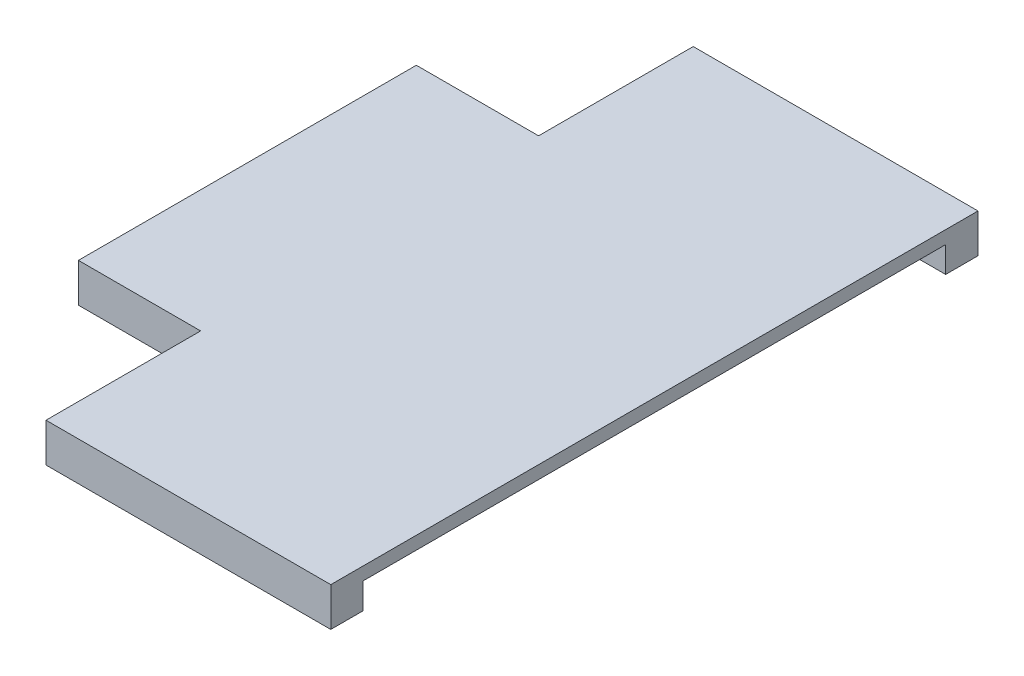
ISO-10303-21;
HEADER;
FILE_DESCRIPTION(('STEP AP214'),'2;1');
FILE_NAME('part.step','',(''),(''),'','','');
FILE_SCHEMA(('AUTOMOTIVE_DESIGN { 1 0 10303 214 1 1 1 1 }'));
ENDSEC;
DATA;
#1=APPLICATION_CONTEXT('core data for automotive mechanical design processes');
#2=APPLICATION_PROTOCOL_DEFINITION('international standard','automotive_design',2000,#1);
#3=PRODUCT_CONTEXT('',#1,'mechanical');
#4=PRODUCT('Part','Part','',(#3));
#5=PRODUCT_RELATED_PRODUCT_CATEGORY('part','',(#4));
#6=PRODUCT_DEFINITION_FORMATION('','',#4);
#7=PRODUCT_DEFINITION_CONTEXT('part definition',#1,'design');
#8=PRODUCT_DEFINITION('design','',#6,#7);
#9=PRODUCT_DEFINITION_SHAPE('','',#8);
#10=(LENGTH_UNIT() NAMED_UNIT(*) SI_UNIT(.MILLI.,.METRE.));
#11=(NAMED_UNIT(*) PLANE_ANGLE_UNIT() SI_UNIT($,.RADIAN.));
#12=(NAMED_UNIT(*) SI_UNIT($,.STERADIAN.) SOLID_ANGLE_UNIT());
#13=UNCERTAINTY_MEASURE_WITH_UNIT(LENGTH_MEASURE(1.E-05),#10,'distance_accuracy_value','');
#14=(GEOMETRIC_REPRESENTATION_CONTEXT(3) GLOBAL_UNCERTAINTY_ASSIGNED_CONTEXT((#13)) GLOBAL_UNIT_ASSIGNED_CONTEXT((#10,
#11,#12)) REPRESENTATION_CONTEXT('',''));
#15=CARTESIAN_POINT('',(0.,0.,0.));
#16=DIRECTION('',(0.,0.,1.));
#17=DIRECTION('',(1.,0.,0.));
#18=AXIS2_PLACEMENT_3D('',#15,#16,#17);
#19=CARTESIAN_POINT('',(-56.,0.,-76.1063147334456));
#20=DIRECTION('',(0.,1.,0.));
#21=DIRECTION('',(0.,0.,1.));
#22=AXIS2_PLACEMENT_3D('',#19,#20,#21);
#23=PLANE('',#22);
#24=DIRECTION('',(0.,0.,1.));
#25=VECTOR('',#24,1.);
#26=CARTESIAN_POINT('',(-56.,0.,0.));
#27=LINE('',#26,#25);
#28=CARTESIAN_POINT('',(-56.,0.,-4.99999999999997));
#29=VERTEX_POINT('',#28);
#30=CARTESIAN_POINT('',(-56.,0.,0.));
#31=VERTEX_POINT('',#30);
#32=EDGE_CURVE('E148',#29,#31,#27,.T.);
#33=ORIENTED_EDGE('',*,*,#32,.F.);
#34=DIRECTION('',(-1.,0.,0.));
#35=VECTOR('',#34,1.);
#36=CARTESIAN_POINT('',(-56.,0.,-4.99999999999997));
#37=LINE('',#36,#35);
#38=CARTESIAN_POINT('',(-12.,0.,-4.99999999999997));
#39=VERTEX_POINT('',#38);
#40=EDGE_CURVE('E217',#39,#29,#37,.T.);
#41=ORIENTED_EDGE('',*,*,#40,.F.);
#42=DIRECTION('',(0.,0.,-1.));
#43=VECTOR('',#42,1.);
#44=CARTESIAN_POINT('',(-12.,0.,-100.));
#45=LINE('',#44,#43);
#46=CARTESIAN_POINT('',(-12.,0.,0.));
#47=VERTEX_POINT('',#46);
#48=EDGE_CURVE('E152',#47,#39,#45,.T.);
#49=ORIENTED_EDGE('',*,*,#48,.F.);
#50=DIRECTION('',(1.,0.,0.));
#51=VECTOR('',#50,1.);
#52=CARTESIAN_POINT('',(-12.,0.,0.));
#53=LINE('',#52,#51);
#54=EDGE_CURVE('E122',#31,#47,#53,.T.);
#55=ORIENTED_EDGE('',*,*,#54,.F.);
#56=EDGE_LOOP('',(#33,#41,#49,#55));
#57=FACE_BOUND('',#56,.T.);
#58=ADVANCED_FACE('F31',(#57),#23,.F.);
#59=CARTESIAN_POINT('',(-12.,0.,-95.));
#60=VERTEX_POINT('',#59);
#61=CARTESIAN_POINT('',(-12.,0.,-100.));
#62=VERTEX_POINT('',#61);
#63=EDGE_CURVE('E151',#60,#62,#45,.T.);
#64=ORIENTED_EDGE('',*,*,#63,.F.);
#65=DIRECTION('',(1.,0.,0.));
#66=VECTOR('',#65,1.);
#67=CARTESIAN_POINT('',(-56.,0.,-95.));
#68=LINE('',#67,#66);
#69=CARTESIAN_POINT('',(-56.,0.,-95.));
#70=VERTEX_POINT('',#69);
#71=EDGE_CURVE('E214',#70,#60,#68,.T.);
#72=ORIENTED_EDGE('',*,*,#71,.F.);
#73=DIRECTION('',(0.,0.,1.));
#74=VECTOR('',#73,1.);
#75=CARTESIAN_POINT('',(-56.,0.,-100.));
#76=LINE('',#75,#74);
#77=CARTESIAN_POINT('',(-56.,0.,-100.));
#78=VERTEX_POINT('',#77);
#79=EDGE_CURVE('E135',#78,#70,#76,.T.);
#80=ORIENTED_EDGE('',*,*,#79,.F.);
#81=DIRECTION('',(-1.,0.,0.));
#82=VECTOR('',#81,1.);
#83=CARTESIAN_POINT('',(-12.,0.,-100.));
#84=LINE('',#83,#82);
#85=EDGE_CURVE('E82',#62,#78,#84,.T.);
#86=ORIENTED_EDGE('',*,*,#85,.F.);
#87=EDGE_LOOP('',(#64,#72,#80,#86));
#88=FACE_BOUND('',#87,.T.);
#89=ADVANCED_FACE('F331',(#88),#23,.F.);
#90=DIRECTION('',(-1.,0.,0.));
#91=VECTOR('',#90,1.);
#92=CARTESIAN_POINT('',(-74.8864883295229,0.,-76.1063147334456));
#93=LINE('',#92,#91);
#94=CARTESIAN_POINT('',(-56.,0.,-76.1063147334456));
#95=VERTEX_POINT('',#94);
#96=CARTESIAN_POINT('',(-74.8864883295229,0.,-76.1063147334456));
#97=VERTEX_POINT('',#96);
#98=EDGE_CURVE('E138',#95,#97,#93,.T.);
#99=ORIENTED_EDGE('',*,*,#98,.F.);
#100=DIRECTION('',(0.,0.,-1.));
#101=VECTOR('',#100,1.);
#102=CARTESIAN_POINT('',(-56.,0.,-95.));
#103=LINE('',#102,#101);
#104=CARTESIAN_POINT('',(-56.,0.,-73.2832579399384));
#105=VERTEX_POINT('',#104);
#106=EDGE_CURVE('E211',#105,#95,#103,.T.);
#107=ORIENTED_EDGE('',*,*,#106,.F.);
#108=DIRECTION('',(1.,0.,0.));
#109=VECTOR('',#108,1.);
#110=CARTESIAN_POINT('',(-74.8864883295229,0.,-73.2832579399384));
#111=LINE('',#110,#109);
#112=CARTESIAN_POINT('',(-74.8864883295229,0.,-73.2832579399384));
#113=VERTEX_POINT('',#112);
#114=EDGE_CURVE('E208',#113,#105,#111,.T.);
#115=ORIENTED_EDGE('',*,*,#114,.F.);
#116=DIRECTION('',(0.,0.,1.));
#117=VECTOR('',#116,1.);
#118=CARTESIAN_POINT('',(-74.8864883295229,0.,-23.8936852665544));
#119=LINE('',#118,#117);
#120=EDGE_CURVE('E142',#97,#113,#119,.T.);
#121=ORIENTED_EDGE('',*,*,#120,.F.);
#122=EDGE_LOOP('',(#99,#107,#115,#121));
#123=FACE_BOUND('',#122,.T.);
#124=ADVANCED_FACE('F310',(#123),#23,.F.);
#125=CARTESIAN_POINT('',(-56.,6.,-100.));
#126=DIRECTION('',(1.,0.,0.));
#127=DIRECTION('',(0.,0.,-1.));
#128=AXIS2_PLACEMENT_3D('',#125,#126,#127);
#129=PLANE('',#128);
#130=ORIENTED_EDGE('',*,*,#79,.T.);
#131=DIRECTION('',(0.,-1.,0.));
#132=VECTOR('',#131,1.);
#133=CARTESIAN_POINT('',(-56.,4.,-95.));
#134=LINE('',#133,#132);
#135=CARTESIAN_POINT('',(-56.,4.,-95.));
#136=VERTEX_POINT('',#135);
#137=EDGE_CURVE('E185',#136,#70,#134,.T.);
#138=ORIENTED_EDGE('',*,*,#137,.F.);
#139=DIRECTION('',(0.,0.,-1.));
#140=VECTOR('',#139,1.);
#141=CARTESIAN_POINT('',(-56.,4.,-95.));
#142=LINE('',#141,#140);
#143=CARTESIAN_POINT('',(-56.,4.,-76.1063147334456));
#144=VERTEX_POINT('',#143);
#145=EDGE_CURVE('E182',#144,#136,#142,.T.);
#146=ORIENTED_EDGE('',*,*,#145,.F.);
#147=DIRECTION('',(0.,-1.,0.));
#148=VECTOR('',#147,1.);
#149=CARTESIAN_POINT('',(-56.,6.,-76.1063147334456));
#150=LINE('',#149,#148);
#151=CARTESIAN_POINT('',(-56.,6.,-76.1063147334456));
#152=VERTEX_POINT('',#151);
#153=EDGE_CURVE('E39',#152,#144,#150,.T.);
#154=ORIENTED_EDGE('',*,*,#153,.F.);
#155=DIRECTION('',(0.,0.,1.));
#156=VECTOR('',#155,1.);
#157=CARTESIAN_POINT('',(-56.,6.,-100.));
#158=LINE('',#157,#156);
#159=CARTESIAN_POINT('',(-56.,6.,-100.));
#160=VERTEX_POINT('',#159);
#161=EDGE_CURVE('E155',#160,#152,#158,.T.);
#162=ORIENTED_EDGE('',*,*,#161,.F.);
#163=DIRECTION('',(0.,-1.,0.));
#164=VECTOR('',#163,1.);
#165=CARTESIAN_POINT('',(-56.,6.,-100.));
#166=LINE('',#165,#164);
#167=EDGE_CURVE('E131',#160,#78,#166,.T.);
#168=ORIENTED_EDGE('',*,*,#167,.T.);
#169=EDGE_LOOP('',(#130,#138,#146,#154,#162,#168));
#170=FACE_BOUND('',#169,.T.);
#171=ADVANCED_FACE('F33',(#170),#129,.F.);
#172=CARTESIAN_POINT('',(-74.8864883295229,6.,-76.1063147334456));
#173=DIRECTION('',(0.,0.,1.));
#174=DIRECTION('',(1.,0.,0.));
#175=AXIS2_PLACEMENT_3D('',#172,#173,#174);
#176=PLANE('',#175);
#177=ORIENTED_EDGE('',*,*,#98,.T.);
#178=DIRECTION('',(0.,-1.,0.));
#179=VECTOR('',#178,1.);
#180=CARTESIAN_POINT('',(-74.8864883295229,6.,-76.1063147334456));
#181=LINE('',#180,#179);
#182=CARTESIAN_POINT('',(-74.8864883295229,6.,-76.1063147334456));
#183=VERTEX_POINT('',#182);
#184=EDGE_CURVE('E165',#183,#97,#181,.T.);
#185=ORIENTED_EDGE('',*,*,#184,.F.);
#186=DIRECTION('',(-1.,0.,0.));
#187=VECTOR('',#186,1.);
#188=CARTESIAN_POINT('',(-74.8864883295229,6.,-76.1063147334456));
#189=LINE('',#188,#187);
#190=EDGE_CURVE('E91',#152,#183,#189,.T.);
#191=ORIENTED_EDGE('',*,*,#190,.F.);
#192=ORIENTED_EDGE('',*,*,#153,.T.);
#193=DIRECTION('',(0.,-1.,0.));
#194=VECTOR('',#193,1.);
#195=CARTESIAN_POINT('',(-56.,6.,-76.1063147334456));
#196=LINE('',#195,#194);
#197=EDGE_CURVE('E173',#144,#95,#196,.T.);
#198=ORIENTED_EDGE('',*,*,#197,.T.);
#199=EDGE_LOOP('',(#177,#185,#191,#192,#198));
#200=FACE_BOUND('',#199,.T.);
#201=ADVANCED_FACE('F170',(#200),#176,.F.);
#202=CARTESIAN_POINT('',(-74.8864883295229,6.,-23.8936852665544));
#203=DIRECTION('',(1.,0.,0.));
#204=DIRECTION('',(0.,0.,-1.));
#205=AXIS2_PLACEMENT_3D('',#202,#203,#204);
#206=PLANE('',#205);
#207=ORIENTED_EDGE('',*,*,#120,.T.);
#208=DIRECTION('',(0.,-1.,0.));
#209=VECTOR('',#208,1.);
#210=CARTESIAN_POINT('',(-74.8864883295229,4.,-73.2832579399384));
#211=LINE('',#210,#209);
#212=CARTESIAN_POINT('',(-74.8864883295229,4.,-73.2832579399384));
#213=VERTEX_POINT('',#212);
#214=EDGE_CURVE('E234',#213,#113,#211,.T.);
#215=ORIENTED_EDGE('',*,*,#214,.F.);
#216=DIRECTION('',(0.,0.,-1.));
#217=VECTOR('',#216,1.);
#218=CARTESIAN_POINT('',(-74.8864883295229,4.,-73.2832579399384));
#219=LINE('',#218,#217);
#220=CARTESIAN_POINT('',(-74.8864883295229,4.,-26.7167420600616));
#221=VERTEX_POINT('',#220);
#222=EDGE_CURVE('E195',#221,#213,#219,.T.);
#223=ORIENTED_EDGE('',*,*,#222,.F.);
#224=DIRECTION('',(0.,-1.,0.));
#225=VECTOR('',#224,1.);
#226=CARTESIAN_POINT('',(-74.8864883295229,4.,-26.7167420600616));
#227=LINE('',#226,#225);
#228=CARTESIAN_POINT('',(-74.8864883295229,0.,-26.7167420600616));
#229=VERTEX_POINT('',#228);
#230=EDGE_CURVE('E237',#221,#229,#227,.T.);
#231=ORIENTED_EDGE('',*,*,#230,.T.);
#232=CARTESIAN_POINT('',(-74.8864883295229,0.,-23.8936852665544));
#233=VERTEX_POINT('',#232);
#234=EDGE_CURVE('E141',#229,#233,#119,.T.);
#235=ORIENTED_EDGE('',*,*,#234,.T.);
#236=DIRECTION('',(0.,-1.,0.));
#237=VECTOR('',#236,1.);
#238=CARTESIAN_POINT('',(-74.8864883295229,6.,-23.8936852665544));
#239=LINE('',#238,#237);
#240=CARTESIAN_POINT('',(-74.8864883295229,6.,-23.8936852665544));
#241=VERTEX_POINT('',#240);
#242=EDGE_CURVE('E162',#241,#233,#239,.T.);
#243=ORIENTED_EDGE('',*,*,#242,.F.);
#244=DIRECTION('',(0.,0.,1.));
#245=VECTOR('',#244,1.);
#246=CARTESIAN_POINT('',(-74.8864883295229,6.,-23.8936852665544));
#247=LINE('',#246,#245);
#248=EDGE_CURVE('E246',#183,#241,#247,.T.);
#249=ORIENTED_EDGE('',*,*,#248,.F.);
#250=ORIENTED_EDGE('',*,*,#184,.T.);
#251=EDGE_LOOP('',(#207,#215,#223,#231,#235,#243,#249,#250));
#252=FACE_BOUND('',#251,.T.);
#253=ADVANCED_FACE('F298',(#252),#206,.F.);
#254=CARTESIAN_POINT('',(-74.8864883295229,6.,-23.8936852665544));
#255=DIRECTION('',(0.,0.,-1.));
#256=DIRECTION('',(-1.,0.,0.));
#257=AXIS2_PLACEMENT_3D('',#254,#255,#256);
#258=PLANE('',#257);
#259=DIRECTION('',(1.,0.,0.));
#260=VECTOR('',#259,1.);
#261=CARTESIAN_POINT('',(-74.8864883295229,0.,-23.8936852665544));
#262=LINE('',#261,#260);
#263=CARTESIAN_POINT('',(-56.,0.,-23.8936852665544));
#264=VERTEX_POINT('',#263);
#265=EDGE_CURVE('E145',#233,#264,#262,.T.);
#266=ORIENTED_EDGE('',*,*,#265,.T.);
#267=DIRECTION('',(0.,1.,0.));
#268=VECTOR('',#267,1.);
#269=CARTESIAN_POINT('',(-56.,6.,-23.8936852665544));
#270=LINE('',#269,#268);
#271=CARTESIAN_POINT('',(-56.,4.,-23.8936852665544));
#272=VERTEX_POINT('',#271);
#273=EDGE_CURVE('E139',#264,#272,#270,.T.);
#274=ORIENTED_EDGE('',*,*,#273,.T.);
#275=DIRECTION('',(0.,-1.,0.));
#276=VECTOR('',#275,1.);
#277=CARTESIAN_POINT('',(-56.,6.,-23.8936852665544));
#278=LINE('',#277,#276);
#279=CARTESIAN_POINT('',(-56.,6.,-23.8936852665544));
#280=VERTEX_POINT('',#279);
#281=EDGE_CURVE('E159',#280,#272,#278,.T.);
#282=ORIENTED_EDGE('',*,*,#281,.F.);
#283=DIRECTION('',(1.,0.,0.));
#284=VECTOR('',#283,1.);
#285=CARTESIAN_POINT('',(-74.8864883295229,6.,-23.8936852665544));
#286=LINE('',#285,#284);
#287=EDGE_CURVE('E248',#241,#280,#286,.T.);
#288=ORIENTED_EDGE('',*,*,#287,.F.);
#289=ORIENTED_EDGE('',*,*,#242,.T.);
#290=EDGE_LOOP('',(#266,#274,#282,#288,#289));
#291=FACE_BOUND('',#290,.T.);
#292=ADVANCED_FACE('F254',(#291),#258,.F.);
#293=CARTESIAN_POINT('',(-56.,6.,0.));
#294=DIRECTION('',(1.,0.,0.));
#295=DIRECTION('',(0.,0.,-1.));
#296=AXIS2_PLACEMENT_3D('',#293,#294,#295);
#297=PLANE('',#296);
#298=DIRECTION('',(0.,0.,-1.));
#299=VECTOR('',#298,1.);
#300=CARTESIAN_POINT('',(-56.,4.,-4.99999999999997));
#301=LINE('',#300,#299);
#302=CARTESIAN_POINT('',(-56.,4.,-4.99999999999997));
#303=VERTEX_POINT('',#302);
#304=EDGE_CURVE('E284',#303,#272,#301,.T.);
#305=ORIENTED_EDGE('',*,*,#304,.F.);
#306=DIRECTION('',(0.,-1.,0.));
#307=VECTOR('',#306,1.);
#308=CARTESIAN_POINT('',(-56.,4.,-4.99999999999997));
#309=LINE('',#308,#307);
#310=EDGE_CURVE('E221',#303,#29,#309,.T.);
#311=ORIENTED_EDGE('',*,*,#310,.T.);
#312=ORIENTED_EDGE('',*,*,#32,.T.);
#313=DIRECTION('',(0.,-1.,0.));
#314=VECTOR('',#313,1.);
#315=CARTESIAN_POINT('',(-56.,6.,0.));
#316=LINE('',#315,#314);
#317=CARTESIAN_POINT('',(-56.,6.,0.));
#318=VERTEX_POINT('',#317);
#319=EDGE_CURVE('E126',#318,#31,#316,.T.);
#320=ORIENTED_EDGE('',*,*,#319,.F.);
#321=DIRECTION('',(0.,0.,1.));
#322=VECTOR('',#321,1.);
#323=CARTESIAN_POINT('',(-56.,6.,0.));
#324=LINE('',#323,#322);
#325=EDGE_CURVE('E113',#280,#318,#324,.T.);
#326=ORIENTED_EDGE('',*,*,#325,.F.);
#327=ORIENTED_EDGE('',*,*,#281,.T.);
#328=EDGE_LOOP('',(#305,#311,#312,#320,#326,#327));
#329=FACE_BOUND('',#328,.T.);
#330=ADVANCED_FACE('F258',(#329),#297,.F.);
#331=CARTESIAN_POINT('',(-12.,6.,0.));
#332=DIRECTION('',(0.,0.,-1.));
#333=DIRECTION('',(-1.,0.,0.));
#334=AXIS2_PLACEMENT_3D('',#331,#332,#333);
#335=PLANE('',#334);
#336=ORIENTED_EDGE('',*,*,#54,.T.);
#337=DIRECTION('',(0.,-1.,0.));
#338=VECTOR('',#337,1.);
#339=CARTESIAN_POINT('',(-12.,6.,0.));
#340=LINE('',#339,#338);
#341=CARTESIAN_POINT('',(-12.,6.,0.));
#342=VERTEX_POINT('',#341);
#343=EDGE_CURVE('E119',#342,#47,#340,.T.);
#344=ORIENTED_EDGE('',*,*,#343,.F.);
#345=DIRECTION('',(1.,0.,0.));
#346=VECTOR('',#345,1.);
#347=CARTESIAN_POINT('',(-12.,6.,0.));
#348=LINE('',#347,#346);
#349=EDGE_CURVE('E106',#318,#342,#348,.T.);
#350=ORIENTED_EDGE('',*,*,#349,.F.);
#351=ORIENTED_EDGE('',*,*,#319,.T.);
#352=EDGE_LOOP('',(#336,#344,#350,#351));
#353=FACE_BOUND('',#352,.T.);
#354=ADVANCED_FACE('F120',(#353),#335,.F.);
#355=CARTESIAN_POINT('',(-12.,6.,-100.));
#356=DIRECTION('',(-1.,0.,0.));
#357=DIRECTION('',(0.,0.,1.));
#358=AXIS2_PLACEMENT_3D('',#355,#356,#357);
#359=PLANE('',#358);
#360=ORIENTED_EDGE('',*,*,#48,.T.);
#361=DIRECTION('',(0.,-1.,0.));
#362=VECTOR('',#361,1.);
#363=CARTESIAN_POINT('',(-12.,4.,-4.99999999999997));
#364=LINE('',#363,#362);
#365=CARTESIAN_POINT('',(-12.,4.,-4.99999999999997));
#366=VERTEX_POINT('',#365);
#367=EDGE_CURVE('E224',#366,#39,#364,.T.);
#368=ORIENTED_EDGE('',*,*,#367,.F.);
#369=DIRECTION('',(0.,0.,1.));
#370=VECTOR('',#369,1.);
#371=CARTESIAN_POINT('',(-12.,4.,-4.99999999999997));
#372=LINE('',#371,#370);
#373=CARTESIAN_POINT('',(-12.,4.,-95.));
#374=VERTEX_POINT('',#373);
#375=EDGE_CURVE('E200',#374,#366,#372,.T.);
#376=ORIENTED_EDGE('',*,*,#375,.F.);
#377=DIRECTION('',(0.,-1.,0.));
#378=VECTOR('',#377,1.);
#379=CARTESIAN_POINT('',(-12.,4.,-95.));
#380=LINE('',#379,#378);
#381=EDGE_CURVE('E227',#374,#60,#380,.T.);
#382=ORIENTED_EDGE('',*,*,#381,.T.);
#383=ORIENTED_EDGE('',*,*,#63,.T.);
#384=DIRECTION('',(0.,-1.,0.));
#385=VECTOR('',#384,1.);
#386=CARTESIAN_POINT('',(-12.,6.,-100.));
#387=LINE('',#386,#385);
#388=CARTESIAN_POINT('',(-12.,6.,-100.));
#389=VERTEX_POINT('',#388);
#390=EDGE_CURVE('E127',#389,#62,#387,.T.);
#391=ORIENTED_EDGE('',*,*,#390,.F.);
#392=DIRECTION('',(0.,0.,-1.));
#393=VECTOR('',#392,1.);
#394=CARTESIAN_POINT('',(-12.,6.,-100.));
#395=LINE('',#394,#393);
#396=EDGE_CURVE('E110',#342,#389,#395,.T.);
#397=ORIENTED_EDGE('',*,*,#396,.F.);
#398=ORIENTED_EDGE('',*,*,#343,.T.);
#399=EDGE_LOOP('',(#360,#368,#376,#382,#383,#391,#397,#398));
#400=FACE_BOUND('',#399,.T.);
#401=ADVANCED_FACE('F129',(#400),#359,.F.);
#402=CARTESIAN_POINT('',(-12.,6.,-100.));
#403=DIRECTION('',(0.,0.,1.));
#404=DIRECTION('',(1.,0.,0.));
#405=AXIS2_PLACEMENT_3D('',#402,#403,#404);
#406=PLANE('',#405);
#407=ORIENTED_EDGE('',*,*,#85,.T.);
#408=ORIENTED_EDGE('',*,*,#167,.F.);
#409=DIRECTION('',(-1.,0.,0.));
#410=VECTOR('',#409,1.);
#411=CARTESIAN_POINT('',(-12.,6.,-100.));
#412=LINE('',#411,#410);
#413=EDGE_CURVE('E55',#389,#160,#412,.T.);
#414=ORIENTED_EDGE('',*,*,#413,.F.);
#415=ORIENTED_EDGE('',*,*,#390,.T.);
#416=EDGE_LOOP('',(#407,#408,#414,#415));
#417=FACE_BOUND('',#416,.T.);
#418=ADVANCED_FACE('F332',(#417),#406,.F.);
#419=CARTESIAN_POINT('',(-56.,6.,-76.1063147334456));
#420=DIRECTION('',(0.,1.,0.));
#421=DIRECTION('',(0.,0.,1.));
#422=AXIS2_PLACEMENT_3D('',#419,#420,#421);
#423=PLANE('',#422);
#424=ORIENTED_EDGE('',*,*,#161,.T.);
#425=ORIENTED_EDGE('',*,*,#190,.T.);
#426=ORIENTED_EDGE('',*,*,#248,.T.);
#427=ORIENTED_EDGE('',*,*,#287,.T.);
#428=ORIENTED_EDGE('',*,*,#325,.T.);
#429=ORIENTED_EDGE('',*,*,#349,.T.);
#430=ORIENTED_EDGE('',*,*,#396,.T.);
#431=ORIENTED_EDGE('',*,*,#413,.T.);
#432=EDGE_LOOP('',(#424,#425,#426,#427,#428,#429,#430,#431));
#433=FACE_BOUND('',#432,.T.);
#434=ADVANCED_FACE('F108',(#433),#423,.T.);
#435=DIRECTION('',(-1.,0.,0.));
#436=VECTOR('',#435,1.);
#437=CARTESIAN_POINT('',(-74.8864883295229,0.,-26.7167420600616));
#438=LINE('',#437,#436);
#439=CARTESIAN_POINT('',(-56.,0.,-26.7167420600616));
#440=VERTEX_POINT('',#439);
#441=EDGE_CURVE('E206',#440,#229,#438,.T.);
#442=ORIENTED_EDGE('',*,*,#441,.F.);
#443=DIRECTION('',(0.,0.,1.));
#444=VECTOR('',#443,1.);
#445=CARTESIAN_POINT('',(-56.,0.,-76.1063147334456));
#446=LINE('',#445,#444);
#447=EDGE_CURVE('E11',#440,#264,#446,.T.);
#448=ORIENTED_EDGE('',*,*,#447,.T.);
#449=ORIENTED_EDGE('',*,*,#265,.F.);
#450=ORIENTED_EDGE('',*,*,#234,.F.);
#451=EDGE_LOOP('',(#442,#448,#449,#450));
#452=FACE_BOUND('',#451,.T.);
#453=ADVANCED_FACE('F339',(#452),#23,.F.);
#454=CARTESIAN_POINT('',(-56.,4.,-4.99999999999997));
#455=DIRECTION('',(-1.,0.,0.));
#456=DIRECTION('',(0.,0.,1.));
#457=AXIS2_PLACEMENT_3D('',#454,#455,#456);
#458=PLANE('',#457);
#459=ORIENTED_EDGE('',*,*,#447,.F.);
#460=DIRECTION('',(0.,-1.,0.));
#461=VECTOR('',#460,1.);
#462=CARTESIAN_POINT('',(-56.,4.,-26.7167420600616));
#463=LINE('',#462,#461);
#464=CARTESIAN_POINT('',(-56.,4.,-26.7167420600616));
#465=VERTEX_POINT('',#464);
#466=EDGE_CURVE('E46',#465,#440,#463,.T.);
#467=ORIENTED_EDGE('',*,*,#466,.F.);
#468=EDGE_CURVE('E220',#272,#465,#301,.T.);
#469=ORIENTED_EDGE('',*,*,#468,.F.);
#470=ORIENTED_EDGE('',*,*,#273,.F.);
#471=EDGE_LOOP('',(#459,#467,#469,#470));
#472=FACE_BOUND('',#471,.T.);
#473=ADVANCED_FACE('F282',(#472),#458,.F.);
#474=CARTESIAN_POINT('',(-56.,4.,-95.));
#475=DIRECTION('',(-1.,0.,0.));
#476=DIRECTION('',(0.,0.,1.));
#477=AXIS2_PLACEMENT_3D('',#474,#475,#476);
#478=PLANE('',#477);
#479=CARTESIAN_POINT('',(-56.,4.,-73.2832579399384));
#480=VERTEX_POINT('',#479);
#481=EDGE_CURVE('E190',#480,#144,#142,.T.);
#482=ORIENTED_EDGE('',*,*,#481,.F.);
#483=DIRECTION('',(0.,-1.,0.));
#484=VECTOR('',#483,1.);
#485=CARTESIAN_POINT('',(-56.,4.,-73.2832579399384));
#486=LINE('',#485,#484);
#487=EDGE_CURVE('E231',#480,#105,#486,.T.);
#488=ORIENTED_EDGE('',*,*,#487,.T.);
#489=ORIENTED_EDGE('',*,*,#106,.T.);
#490=ORIENTED_EDGE('',*,*,#197,.F.);
#491=EDGE_LOOP('',(#482,#488,#489,#490));
#492=FACE_BOUND('',#491,.T.);
#493=ADVANCED_FACE('F314',(#492),#478,.F.);
#494=CARTESIAN_POINT('',(-56.,4.,-4.99999999999997));
#495=DIRECTION('',(0.,0.,1.));
#496=DIRECTION('',(1.,0.,0.));
#497=AXIS2_PLACEMENT_3D('',#494,#495,#496);
#498=PLANE('',#497);
#499=ORIENTED_EDGE('',*,*,#40,.T.);
#500=ORIENTED_EDGE('',*,*,#310,.F.);
#501=DIRECTION('',(-1.,0.,0.));
#502=VECTOR('',#501,1.);
#503=CARTESIAN_POINT('',(-56.,4.,-4.99999999999997));
#504=LINE('',#503,#502);
#505=EDGE_CURVE('E203',#366,#303,#504,.T.);
#506=ORIENTED_EDGE('',*,*,#505,.F.);
#507=ORIENTED_EDGE('',*,*,#367,.T.);
#508=EDGE_LOOP('',(#499,#500,#506,#507));
#509=FACE_BOUND('',#508,.T.);
#510=ADVANCED_FACE('F446',(#509),#498,.F.);
#511=CARTESIAN_POINT('',(-56.,4.,-95.));
#512=DIRECTION('',(0.,0.,-1.));
#513=DIRECTION('',(-1.,0.,0.));
#514=AXIS2_PLACEMENT_3D('',#511,#512,#513);
#515=PLANE('',#514);
#516=ORIENTED_EDGE('',*,*,#71,.T.);
#517=ORIENTED_EDGE('',*,*,#381,.F.);
#518=DIRECTION('',(1.,0.,0.));
#519=VECTOR('',#518,1.);
#520=CARTESIAN_POINT('',(-56.,4.,-95.));
#521=LINE('',#520,#519);
#522=EDGE_CURVE('E193',#136,#374,#521,.T.);
#523=ORIENTED_EDGE('',*,*,#522,.F.);
#524=ORIENTED_EDGE('',*,*,#137,.T.);
#525=EDGE_LOOP('',(#516,#517,#523,#524));
#526=FACE_BOUND('',#525,.T.);
#527=ADVANCED_FACE('F327',(#526),#515,.F.);
#528=CARTESIAN_POINT('',(-74.8864883295229,4.,-73.2832579399384));
#529=DIRECTION('',(0.,0.,-1.));
#530=DIRECTION('',(-1.,0.,0.));
#531=AXIS2_PLACEMENT_3D('',#528,#529,#530);
#532=PLANE('',#531);
#533=ORIENTED_EDGE('',*,*,#114,.T.);
#534=ORIENTED_EDGE('',*,*,#487,.F.);
#535=DIRECTION('',(1.,0.,0.));
#536=VECTOR('',#535,1.);
#537=CARTESIAN_POINT('',(-74.8864883295229,4.,-73.2832579399384));
#538=LINE('',#537,#536);
#539=EDGE_CURVE('E191',#213,#480,#538,.T.);
#540=ORIENTED_EDGE('',*,*,#539,.F.);
#541=ORIENTED_EDGE('',*,*,#214,.T.);
#542=EDGE_LOOP('',(#533,#534,#540,#541));
#543=FACE_BOUND('',#542,.T.);
#544=ADVANCED_FACE('F303',(#543),#532,.F.);
#545=CARTESIAN_POINT('',(-74.8864883295229,4.,-26.7167420600616));
#546=DIRECTION('',(0.,0.,1.));
#547=DIRECTION('',(1.,0.,0.));
#548=AXIS2_PLACEMENT_3D('',#545,#546,#547);
#549=PLANE('',#548);
#550=ORIENTED_EDGE('',*,*,#441,.T.);
#551=ORIENTED_EDGE('',*,*,#230,.F.);
#552=DIRECTION('',(-1.,0.,0.));
#553=VECTOR('',#552,1.);
#554=CARTESIAN_POINT('',(-74.8864883295229,4.,-26.7167420600616));
#555=LINE('',#554,#553);
#556=EDGE_CURVE('E287',#465,#221,#555,.T.);
#557=ORIENTED_EDGE('',*,*,#556,.F.);
#558=ORIENTED_EDGE('',*,*,#466,.T.);
#559=EDGE_LOOP('',(#550,#551,#557,#558));
#560=FACE_BOUND('',#559,.T.);
#561=ADVANCED_FACE('F468',(#560),#549,.F.);
#562=CARTESIAN_POINT('',(-56.,4.,-26.7167420600616));
#563=DIRECTION('',(0.,-1.,0.));
#564=DIRECTION('',(0.,0.,-1.));
#565=AXIS2_PLACEMENT_3D('',#562,#563,#564);
#566=PLANE('',#565);
#567=ORIENTED_EDGE('',*,*,#304,.T.);
#568=ORIENTED_EDGE('',*,*,#468,.T.);
#569=ORIENTED_EDGE('',*,*,#556,.T.);
#570=ORIENTED_EDGE('',*,*,#222,.T.);
#571=ORIENTED_EDGE('',*,*,#539,.T.);
#572=ORIENTED_EDGE('',*,*,#481,.T.);
#573=ORIENTED_EDGE('',*,*,#145,.T.);
#574=ORIENTED_EDGE('',*,*,#522,.T.);
#575=ORIENTED_EDGE('',*,*,#375,.T.);
#576=ORIENTED_EDGE('',*,*,#505,.T.);
#577=EDGE_LOOP('',(#567,#568,#569,#570,#571,#572,#573,#574,#575,#576));
#578=FACE_BOUND('',#577,.T.);
#579=ADVANCED_FACE('F286',(#578),#566,.T.);
#580=CLOSED_SHELL('',(#58,#89,#124,#171,#201,#253,#292,#330,#354,#401,#418,#434,#453,#473,#493,
#510,#527,#544,#561,#579));
#581=MANIFOLD_SOLID_BREP('B2',#580);
#582=ADVANCED_BREP_SHAPE_REPRESENTATION('',(#18,#581),#14);
#583=SHAPE_DEFINITION_REPRESENTATION(#9,#582);
ENDSEC;
END-ISO-10303-21;
